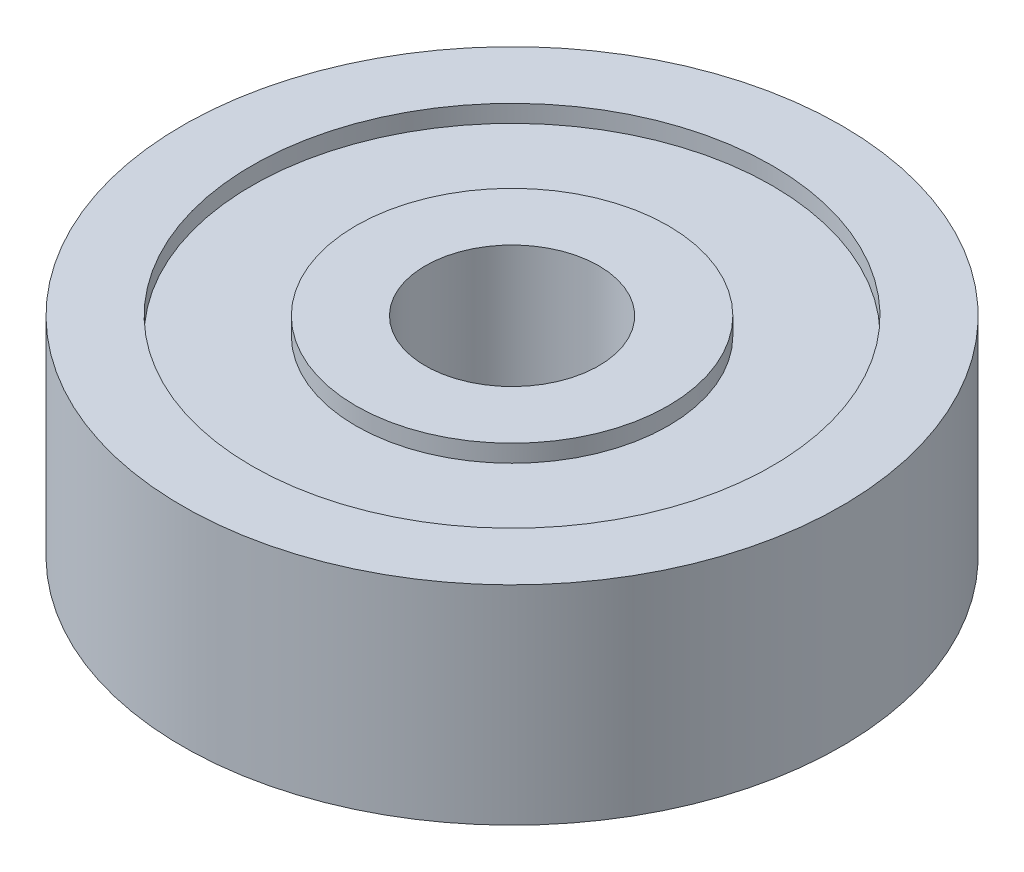
ISO-10303-21;
HEADER;
FILE_DESCRIPTION(('STEP AP214'),'2;1');
FILE_NAME('part.step','',(''),(''),'','','');
FILE_SCHEMA(('AUTOMOTIVE_DESIGN { 1 0 10303 214 1 1 1 1 }'));
ENDSEC;
DATA;
#1=APPLICATION_CONTEXT('core data for automotive mechanical design processes');
#2=APPLICATION_PROTOCOL_DEFINITION('international standard','automotive_design',2000,#1);
#3=PRODUCT_CONTEXT('',#1,'mechanical');
#4=PRODUCT('Part','Part','',(#3));
#5=PRODUCT_RELATED_PRODUCT_CATEGORY('part','',(#4));
#6=PRODUCT_DEFINITION_FORMATION('','',#4);
#7=PRODUCT_DEFINITION_CONTEXT('part definition',#1,'design');
#8=PRODUCT_DEFINITION('design','',#6,#7);
#9=PRODUCT_DEFINITION_SHAPE('','',#8);
#10=(LENGTH_UNIT() NAMED_UNIT(*) SI_UNIT(.MILLI.,.METRE.));
#11=(NAMED_UNIT(*) PLANE_ANGLE_UNIT() SI_UNIT($,.RADIAN.));
#12=(NAMED_UNIT(*) SI_UNIT($,.STERADIAN.) SOLID_ANGLE_UNIT());
#13=UNCERTAINTY_MEASURE_WITH_UNIT(LENGTH_MEASURE(1.E-05),#10,'distance_accuracy_value','');
#14=(GEOMETRIC_REPRESENTATION_CONTEXT(3) GLOBAL_UNCERTAINTY_ASSIGNED_CONTEXT((#13)) GLOBAL_UNIT_ASSIGNED_CONTEXT((#10,
#11,#12)) REPRESENTATION_CONTEXT('',''));
#15=CARTESIAN_POINT('',(0.,0.,0.));
#16=DIRECTION('',(0.,0.,1.));
#17=DIRECTION('',(1.,0.,0.));
#18=AXIS2_PLACEMENT_3D('',#15,#16,#17);
#19=CARTESIAN_POINT('',(4.5,0.,0.));
#20=DIRECTION('',(0.,-1.,0.));
#21=DIRECTION('',(0.,0.,-1.));
#22=AXIS2_PLACEMENT_3D('',#19,#20,#21);
#23=PLANE('',#22);
#24=CARTESIAN_POINT('',(0.,0.,0.));
#25=DIRECTION('',(0.,-1.,0.));
#26=DIRECTION('',(0.,0.,-1.));
#27=AXIS2_PLACEMENT_3D('',#24,#25,#26);
#28=CIRCLE('',#27,4.5);
#29=CARTESIAN_POINT('',(0.,0.,-4.5));
#30=VERTEX_POINT('',#29);
#31=EDGE_CURVE('E75',#30,#30,#28,.T.);
#32=ORIENTED_EDGE('',*,*,#31,.T.);
#33=EDGE_LOOP('',(#32));
#34=FACE_BOUND('',#33,.T.);
#35=CARTESIAN_POINT('',(0.,0.,0.));
#36=DIRECTION('',(0.,-1.,0.));
#37=DIRECTION('',(0.,0.,-1.));
#38=AXIS2_PLACEMENT_3D('',#35,#36,#37);
#39=CIRCLE('',#38,2.5);
#40=CARTESIAN_POINT('',(0.,0.,-2.5));
#41=VERTEX_POINT('',#40);
#42=EDGE_CURVE('E10',#41,#41,#39,.T.);
#43=ORIENTED_EDGE('',*,*,#42,.F.);
#44=EDGE_LOOP('',(#43));
#45=FACE_BOUND('',#44,.T.);
#46=ADVANCED_FACE('F35',(#34,#45),#23,.T.);
#47=CARTESIAN_POINT('',(0.,0.,0.));
#48=DIRECTION('',(0.,-1.,0.));
#49=DIRECTION('',(0.,0.,-1.));
#50=AXIS2_PLACEMENT_3D('',#47,#48,#49);
#51=CYLINDRICAL_SURFACE('',#50,2.5);
#52=ORIENTED_EDGE('',*,*,#42,.T.);
#53=EDGE_LOOP('',(#52));
#54=FACE_BOUND('',#53,.T.);
#55=CARTESIAN_POINT('',(0.,6.,0.));
#56=DIRECTION('',(0.,-1.,0.));
#57=DIRECTION('',(0.,0.,-1.));
#58=AXIS2_PLACEMENT_3D('',#55,#56,#57);
#59=CIRCLE('',#58,2.5);
#60=CARTESIAN_POINT('',(0.,6.,-2.5));
#61=VERTEX_POINT('',#60);
#62=EDGE_CURVE('E41',#61,#61,#59,.T.);
#63=ORIENTED_EDGE('',*,*,#62,.F.);
#64=EDGE_LOOP('',(#63));
#65=FACE_BOUND('',#64,.T.);
#66=ADVANCED_FACE('F93',(#54,#65),#51,.F.);
#67=CARTESIAN_POINT('',(2.5,6.,0.));
#68=DIRECTION('',(0.,1.,0.));
#69=DIRECTION('',(0.,0.,1.));
#70=AXIS2_PLACEMENT_3D('',#67,#68,#69);
#71=PLANE('',#70);
#72=ORIENTED_EDGE('',*,*,#62,.T.);
#73=EDGE_LOOP('',(#72));
#74=FACE_BOUND('',#73,.T.);
#75=CARTESIAN_POINT('',(0.,6.,0.));
#76=DIRECTION('',(0.,-1.,0.));
#77=DIRECTION('',(0.,0.,-1.));
#78=AXIS2_PLACEMENT_3D('',#75,#76,#77);
#79=CIRCLE('',#78,4.5);
#80=CARTESIAN_POINT('',(0.,6.,-4.5));
#81=VERTEX_POINT('',#80);
#82=EDGE_CURVE('E45',#81,#81,#79,.T.);
#83=ORIENTED_EDGE('',*,*,#82,.F.);
#84=EDGE_LOOP('',(#83));
#85=FACE_BOUND('',#84,.T.);
#86=ADVANCED_FACE('F97',(#74,#85),#71,.T.);
#87=CARTESIAN_POINT('',(0.,0.,0.));
#88=DIRECTION('',(0.,-1.,0.));
#89=DIRECTION('',(0.,0.,-1.));
#90=AXIS2_PLACEMENT_3D('',#87,#88,#89);
#91=CYLINDRICAL_SURFACE('',#90,4.5);
#92=ORIENTED_EDGE('',*,*,#82,.T.);
#93=EDGE_LOOP('',(#92));
#94=FACE_BOUND('',#93,.T.);
#95=CARTESIAN_POINT('',(0.,5.5,0.));
#96=DIRECTION('',(0.,-1.,0.));
#97=DIRECTION('',(0.,0.,-1.));
#98=AXIS2_PLACEMENT_3D('',#95,#96,#97);
#99=CIRCLE('',#98,4.5);
#100=CARTESIAN_POINT('',(0.,5.5,-4.5));
#101=VERTEX_POINT('',#100);
#102=EDGE_CURVE('E49',#101,#101,#99,.T.);
#103=ORIENTED_EDGE('',*,*,#102,.F.);
#104=EDGE_LOOP('',(#103));
#105=FACE_BOUND('',#104,.T.);
#106=ADVANCED_FACE('F101',(#94,#105),#91,.T.);
#107=CARTESIAN_POINT('',(4.5,5.5,0.));
#108=DIRECTION('',(0.,1.,0.));
#109=DIRECTION('',(0.,0.,1.));
#110=AXIS2_PLACEMENT_3D('',#107,#108,#109);
#111=PLANE('',#110);
#112=ORIENTED_EDGE('',*,*,#102,.T.);
#113=EDGE_LOOP('',(#112));
#114=FACE_BOUND('',#113,.T.);
#115=CARTESIAN_POINT('',(0.,5.5,0.));
#116=DIRECTION('',(0.,-1.,0.));
#117=DIRECTION('',(0.,0.,-1.));
#118=AXIS2_PLACEMENT_3D('',#115,#116,#117);
#119=CIRCLE('',#118,7.5);
#120=CARTESIAN_POINT('',(0.,5.5,-7.5));
#121=VERTEX_POINT('',#120);
#122=EDGE_CURVE('E54',#121,#121,#119,.T.);
#123=ORIENTED_EDGE('',*,*,#122,.F.);
#124=EDGE_LOOP('',(#123));
#125=FACE_BOUND('',#124,.T.);
#126=ADVANCED_FACE('F107',(#114,#125),#111,.T.);
#127=CARTESIAN_POINT('',(0.,0.,0.));
#128=DIRECTION('',(0.,-1.,0.));
#129=DIRECTION('',(0.,0.,-1.));
#130=AXIS2_PLACEMENT_3D('',#127,#128,#129);
#131=CYLINDRICAL_SURFACE('',#130,7.5);
#132=ORIENTED_EDGE('',*,*,#122,.T.);
#133=EDGE_LOOP('',(#132));
#134=FACE_BOUND('',#133,.T.);
#135=CARTESIAN_POINT('',(0.,6.,0.));
#136=DIRECTION('',(0.,-1.,0.));
#137=DIRECTION('',(0.,0.,-1.));
#138=AXIS2_PLACEMENT_3D('',#135,#136,#137);
#139=CIRCLE('',#138,7.5);
#140=CARTESIAN_POINT('',(0.,6.,-7.5));
#141=VERTEX_POINT('',#140);
#142=EDGE_CURVE('E57',#141,#141,#139,.T.);
#143=ORIENTED_EDGE('',*,*,#142,.F.);
#144=EDGE_LOOP('',(#143));
#145=FACE_BOUND('',#144,.T.);
#146=ADVANCED_FACE('F111',(#134,#145),#131,.F.);
#147=CARTESIAN_POINT('',(7.5,6.,0.));
#148=DIRECTION('',(0.,1.,0.));
#149=DIRECTION('',(0.,0.,1.));
#150=AXIS2_PLACEMENT_3D('',#147,#148,#149);
#151=PLANE('',#150);
#152=ORIENTED_EDGE('',*,*,#142,.T.);
#153=EDGE_LOOP('',(#152));
#154=FACE_BOUND('',#153,.T.);
#155=CARTESIAN_POINT('',(0.,6.,0.));
#156=DIRECTION('',(0.,-1.,0.));
#157=DIRECTION('',(0.,0.,-1.));
#158=AXIS2_PLACEMENT_3D('',#155,#156,#157);
#159=CIRCLE('',#158,9.5);
#160=CARTESIAN_POINT('',(0.,6.,-9.5));
#161=VERTEX_POINT('',#160);
#162=EDGE_CURVE('E60',#161,#161,#159,.T.);
#163=ORIENTED_EDGE('',*,*,#162,.F.);
#164=EDGE_LOOP('',(#163));
#165=FACE_BOUND('',#164,.T.);
#166=ADVANCED_FACE('F115',(#154,#165),#151,.T.);
#167=CARTESIAN_POINT('',(0.,0.,0.));
#168=DIRECTION('',(0.,-1.,0.));
#169=DIRECTION('',(0.,0.,-1.));
#170=AXIS2_PLACEMENT_3D('',#167,#168,#169);
#171=CYLINDRICAL_SURFACE('',#170,9.5);
#172=ORIENTED_EDGE('',*,*,#162,.T.);
#173=EDGE_LOOP('',(#172));
#174=FACE_BOUND('',#173,.T.);
#175=CARTESIAN_POINT('',(0.,0.,0.));
#176=DIRECTION('',(0.,-1.,0.));
#177=DIRECTION('',(0.,0.,-1.));
#178=AXIS2_PLACEMENT_3D('',#175,#176,#177);
#179=CIRCLE('',#178,9.5);
#180=CARTESIAN_POINT('',(0.,0.,-9.5));
#181=VERTEX_POINT('',#180);
#182=EDGE_CURVE('E63',#181,#181,#179,.T.);
#183=ORIENTED_EDGE('',*,*,#182,.F.);
#184=EDGE_LOOP('',(#183));
#185=FACE_BOUND('',#184,.T.);
#186=ADVANCED_FACE('F119',(#174,#185),#171,.T.);
#187=CARTESIAN_POINT('',(9.5,0.,0.));
#188=DIRECTION('',(0.,-1.,0.));
#189=DIRECTION('',(0.,0.,-1.));
#190=AXIS2_PLACEMENT_3D('',#187,#188,#189);
#191=PLANE('',#190);
#192=ORIENTED_EDGE('',*,*,#182,.T.);
#193=EDGE_LOOP('',(#192));
#194=FACE_BOUND('',#193,.T.);
#195=CARTESIAN_POINT('',(0.,0.,0.));
#196=DIRECTION('',(0.,-1.,0.));
#197=DIRECTION('',(0.,0.,-1.));
#198=AXIS2_PLACEMENT_3D('',#195,#196,#197);
#199=CIRCLE('',#198,7.5);
#200=CARTESIAN_POINT('',(0.,0.,-7.5));
#201=VERTEX_POINT('',#200);
#202=EDGE_CURVE('E66',#201,#201,#199,.T.);
#203=ORIENTED_EDGE('',*,*,#202,.F.);
#204=EDGE_LOOP('',(#203));
#205=FACE_BOUND('',#204,.T.);
#206=ADVANCED_FACE('F123',(#194,#205),#191,.T.);
#207=CARTESIAN_POINT('',(0.,0.,0.));
#208=DIRECTION('',(0.,-1.,0.));
#209=DIRECTION('',(0.,0.,-1.));
#210=AXIS2_PLACEMENT_3D('',#207,#208,#209);
#211=CYLINDRICAL_SURFACE('',#210,7.5);
#212=ORIENTED_EDGE('',*,*,#202,.T.);
#213=EDGE_LOOP('',(#212));
#214=FACE_BOUND('',#213,.T.);
#215=CARTESIAN_POINT('',(0.,0.5,0.));
#216=DIRECTION('',(0.,-1.,0.));
#217=DIRECTION('',(0.,0.,-1.));
#218=AXIS2_PLACEMENT_3D('',#215,#216,#217);
#219=CIRCLE('',#218,7.5);
#220=CARTESIAN_POINT('',(0.,0.5,-7.5));
#221=VERTEX_POINT('',#220);
#222=EDGE_CURVE('E69',#221,#221,#219,.T.);
#223=ORIENTED_EDGE('',*,*,#222,.F.);
#224=EDGE_LOOP('',(#223));
#225=FACE_BOUND('',#224,.T.);
#226=ADVANCED_FACE('F89',(#214,#225),#211,.F.);
#227=CARTESIAN_POINT('',(7.5,0.5,0.));
#228=DIRECTION('',(0.,-1.,0.));
#229=DIRECTION('',(0.,0.,-1.));
#230=AXIS2_PLACEMENT_3D('',#227,#228,#229);
#231=PLANE('',#230);
#232=ORIENTED_EDGE('',*,*,#222,.T.);
#233=EDGE_LOOP('',(#232));
#234=FACE_BOUND('',#233,.T.);
#235=CARTESIAN_POINT('',(0.,0.499999999999999,0.));
#236=DIRECTION('',(0.,-1.,0.));
#237=DIRECTION('',(0.,0.,-1.));
#238=AXIS2_PLACEMENT_3D('',#235,#236,#237);
#239=CIRCLE('',#238,4.5);
#240=CARTESIAN_POINT('',(0.,0.499999999999999,-4.5));
#241=VERTEX_POINT('',#240);
#242=EDGE_CURVE('E72',#241,#241,#239,.T.);
#243=ORIENTED_EDGE('',*,*,#242,.F.);
#244=EDGE_LOOP('',(#243));
#245=FACE_BOUND('',#244,.T.);
#246=ADVANCED_FACE('F83',(#234,#245),#231,.T.);
#247=CARTESIAN_POINT('',(0.,0.,0.));
#248=DIRECTION('',(0.,-1.,0.));
#249=DIRECTION('',(0.,0.,-1.));
#250=AXIS2_PLACEMENT_3D('',#247,#248,#249);
#251=CYLINDRICAL_SURFACE('',#250,4.5);
#252=ORIENTED_EDGE('',*,*,#242,.T.);
#253=EDGE_LOOP('',(#252));
#254=FACE_BOUND('',#253,.T.);
#255=ORIENTED_EDGE('',*,*,#31,.F.);
#256=EDGE_LOOP('',(#255));
#257=FACE_BOUND('',#256,.T.);
#258=ADVANCED_FACE('F81',(#254,#257),#251,.T.);
#259=CLOSED_SHELL('',(#46,#66,#86,#106,#126,#146,#166,#186,#206,#226,#246,#258));
#260=MANIFOLD_SOLID_BREP('B2',#259);
#261=ADVANCED_BREP_SHAPE_REPRESENTATION('',(#18,#260),#14);
#262=SHAPE_DEFINITION_REPRESENTATION(#9,#261);
ENDSEC;
END-ISO-10303-21;
